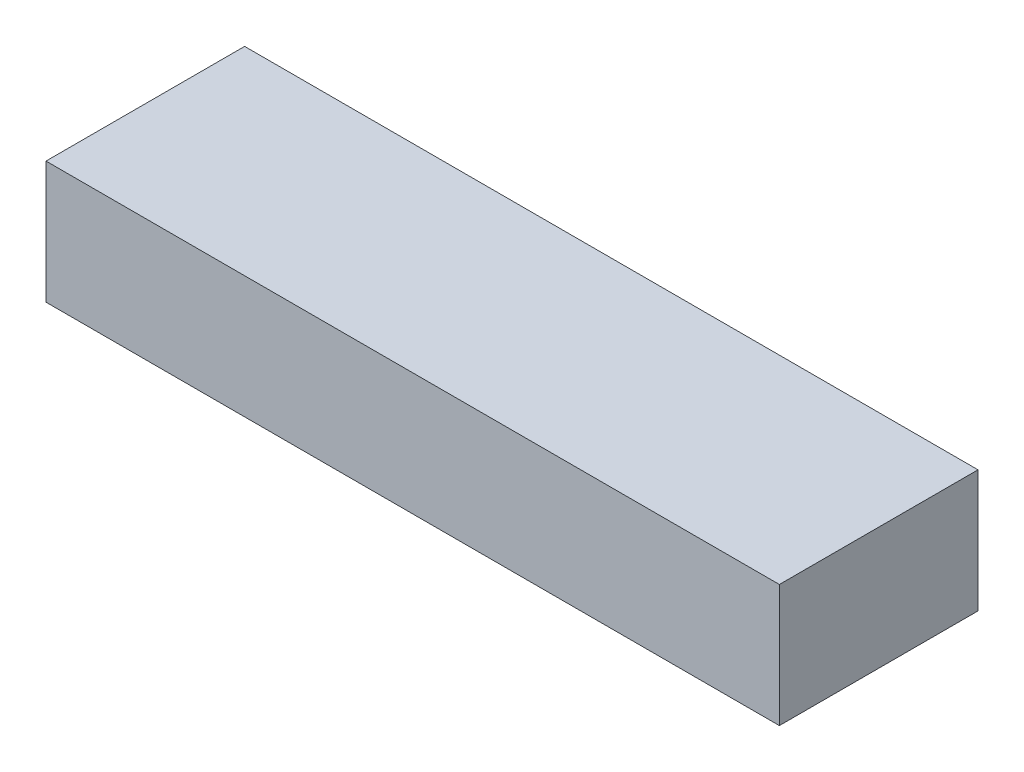
ISO-10303-21;
HEADER;
FILE_DESCRIPTION(('STEP AP214'),'2;1');
FILE_NAME('part.step','',(''),(''),'','','');
FILE_SCHEMA(('AUTOMOTIVE_DESIGN { 1 0 10303 214 1 1 1 1 }'));
ENDSEC;
DATA;
#1=APPLICATION_CONTEXT('core data for automotive mechanical design processes');
#2=APPLICATION_PROTOCOL_DEFINITION('international standard','automotive_design',2000,#1);
#3=PRODUCT_CONTEXT('',#1,'mechanical');
#4=PRODUCT('Part','Part','',(#3));
#5=PRODUCT_RELATED_PRODUCT_CATEGORY('part','',(#4));
#6=PRODUCT_DEFINITION_FORMATION('','',#4);
#7=PRODUCT_DEFINITION_CONTEXT('part definition',#1,'design');
#8=PRODUCT_DEFINITION('design','',#6,#7);
#9=PRODUCT_DEFINITION_SHAPE('','',#8);
#10=(LENGTH_UNIT() NAMED_UNIT(*) SI_UNIT(.MILLI.,.METRE.));
#11=(NAMED_UNIT(*) PLANE_ANGLE_UNIT() SI_UNIT($,.RADIAN.));
#12=(NAMED_UNIT(*) SI_UNIT($,.STERADIAN.) SOLID_ANGLE_UNIT());
#13=UNCERTAINTY_MEASURE_WITH_UNIT(LENGTH_MEASURE(1.E-05),#10,'distance_accuracy_value','');
#14=(GEOMETRIC_REPRESENTATION_CONTEXT(3) GLOBAL_UNCERTAINTY_ASSIGNED_CONTEXT((#13)) GLOBAL_UNIT_ASSIGNED_CONTEXT((#10,
#11,#12)) REPRESENTATION_CONTEXT('',''));
#15=CARTESIAN_POINT('',(0.,0.,0.));
#16=DIRECTION('',(0.,0.,1.));
#17=DIRECTION('',(1.,0.,0.));
#18=AXIS2_PLACEMENT_3D('',#15,#16,#17);
#19=CARTESIAN_POINT('',(0.,25.4,0.));
#20=DIRECTION('',(1.,0.,0.));
#21=DIRECTION('',(0.,0.,-1.));
#22=AXIS2_PLACEMENT_3D('',#19,#20,#21);
#23=PLANE('',#22);
#24=DIRECTION('',(0.,0.,1.));
#25=VECTOR('',#24,1.);
#26=CARTESIAN_POINT('',(0.,0.,0.));
#27=LINE('',#26,#25);
#28=CARTESIAN_POINT('',(0.,0.,-41.275));
#29=VERTEX_POINT('',#28);
#30=CARTESIAN_POINT('',(0.,0.,0.));
#31=VERTEX_POINT('',#30);
#32=EDGE_CURVE('E107',#29,#31,#27,.T.);
#33=ORIENTED_EDGE('',*,*,#32,.T.);
#34=DIRECTION('',(0.,-1.,0.));
#35=VECTOR('',#34,1.);
#36=CARTESIAN_POINT('',(0.,25.4,0.));
#37=LINE('',#36,#35);
#38=CARTESIAN_POINT('',(0.,25.4,0.));
#39=VERTEX_POINT('',#38);
#40=EDGE_CURVE('E11',#39,#31,#37,.T.);
#41=ORIENTED_EDGE('',*,*,#40,.F.);
#42=DIRECTION('',(0.,0.,1.));
#43=VECTOR('',#42,1.);
#44=CARTESIAN_POINT('',(0.,25.4,0.));
#45=LINE('',#44,#43);
#46=CARTESIAN_POINT('',(0.,25.4,-41.275));
#47=VERTEX_POINT('',#46);
#48=EDGE_CURVE('E91',#47,#39,#45,.T.);
#49=ORIENTED_EDGE('',*,*,#48,.F.);
#50=DIRECTION('',(0.,-1.,0.));
#51=VECTOR('',#50,1.);
#52=CARTESIAN_POINT('',(0.,25.4,-41.275));
#53=LINE('',#52,#51);
#54=EDGE_CURVE('E103',#47,#29,#53,.T.);
#55=ORIENTED_EDGE('',*,*,#54,.T.);
#56=EDGE_LOOP('',(#33,#41,#49,#55));
#57=FACE_BOUND('',#56,.T.);
#58=ADVANCED_FACE('F39',(#57),#23,.F.);
#59=CARTESIAN_POINT('',(0.,25.4,0.));
#60=DIRECTION('',(0.,0.,-1.));
#61=DIRECTION('',(-1.,0.,0.));
#62=AXIS2_PLACEMENT_3D('',#59,#60,#61);
#63=PLANE('',#62);
#64=DIRECTION('',(1.,0.,0.));
#65=VECTOR('',#64,1.);
#66=CARTESIAN_POINT('',(0.,0.,0.));
#67=LINE('',#66,#65);
#68=CARTESIAN_POINT('',(152.4,0.,0.));
#69=VERTEX_POINT('',#68);
#70=EDGE_CURVE('E96',#31,#69,#67,.T.);
#71=ORIENTED_EDGE('',*,*,#70,.T.);
#72=DIRECTION('',(0.,-1.,0.));
#73=VECTOR('',#72,1.);
#74=CARTESIAN_POINT('',(152.4,25.4,0.));
#75=LINE('',#74,#73);
#76=CARTESIAN_POINT('',(152.4,25.4,0.));
#77=VERTEX_POINT('',#76);
#78=EDGE_CURVE('E48',#77,#69,#75,.T.);
#79=ORIENTED_EDGE('',*,*,#78,.F.);
#80=DIRECTION('',(1.,0.,0.));
#81=VECTOR('',#80,1.);
#82=CARTESIAN_POINT('',(0.,25.4,0.));
#83=LINE('',#82,#81);
#84=EDGE_CURVE('E86',#39,#77,#83,.T.);
#85=ORIENTED_EDGE('',*,*,#84,.F.);
#86=ORIENTED_EDGE('',*,*,#40,.T.);
#87=EDGE_LOOP('',(#71,#79,#85,#86));
#88=FACE_BOUND('',#87,.T.);
#89=ADVANCED_FACE('F95',(#88),#63,.F.);
#90=CARTESIAN_POINT('',(152.4,25.4,0.));
#91=DIRECTION('',(-1.,0.,0.));
#92=DIRECTION('',(0.,0.,1.));
#93=AXIS2_PLACEMENT_3D('',#90,#91,#92);
#94=PLANE('',#93);
#95=DIRECTION('',(0.,0.,-1.));
#96=VECTOR('',#95,1.);
#97=CARTESIAN_POINT('',(152.4,0.,0.));
#98=LINE('',#97,#96);
#99=CARTESIAN_POINT('',(152.4,0.,-41.275));
#100=VERTEX_POINT('',#99);
#101=EDGE_CURVE('E73',#69,#100,#98,.T.);
#102=ORIENTED_EDGE('',*,*,#101,.T.);
#103=DIRECTION('',(0.,-1.,0.));
#104=VECTOR('',#103,1.);
#105=CARTESIAN_POINT('',(152.4,25.4,-41.275));
#106=LINE('',#105,#104);
#107=CARTESIAN_POINT('',(152.4,25.4,-41.275));
#108=VERTEX_POINT('',#107);
#109=EDGE_CURVE('E98',#108,#100,#106,.T.);
#110=ORIENTED_EDGE('',*,*,#109,.F.);
#111=DIRECTION('',(0.,0.,-1.));
#112=VECTOR('',#111,1.);
#113=CARTESIAN_POINT('',(152.4,25.4,0.));
#114=LINE('',#113,#112);
#115=EDGE_CURVE('E89',#77,#108,#114,.T.);
#116=ORIENTED_EDGE('',*,*,#115,.F.);
#117=ORIENTED_EDGE('',*,*,#78,.T.);
#118=EDGE_LOOP('',(#102,#110,#116,#117));
#119=FACE_BOUND('',#118,.T.);
#120=ADVANCED_FACE('F99',(#119),#94,.F.);
#121=CARTESIAN_POINT('',(0.,25.4,-41.275));
#122=DIRECTION('',(0.,0.,1.));
#123=DIRECTION('',(1.,0.,0.));
#124=AXIS2_PLACEMENT_3D('',#121,#122,#123);
#125=PLANE('',#124);
#126=DIRECTION('',(-1.,0.,0.));
#127=VECTOR('',#126,1.);
#128=CARTESIAN_POINT('',(0.,0.,-41.275));
#129=LINE('',#128,#127);
#130=EDGE_CURVE('E79',#100,#29,#129,.T.);
#131=ORIENTED_EDGE('',*,*,#130,.T.);
#132=ORIENTED_EDGE('',*,*,#54,.F.);
#133=DIRECTION('',(-1.,0.,0.));
#134=VECTOR('',#133,1.);
#135=CARTESIAN_POINT('',(0.,25.4,-41.275));
#136=LINE('',#135,#134);
#137=EDGE_CURVE('E56',#108,#47,#136,.T.);
#138=ORIENTED_EDGE('',*,*,#137,.F.);
#139=ORIENTED_EDGE('',*,*,#109,.T.);
#140=EDGE_LOOP('',(#131,#132,#138,#139));
#141=FACE_BOUND('',#140,.T.);
#142=ADVANCED_FACE('F120',(#141),#125,.F.);
#143=CARTESIAN_POINT('',(0.,25.4,0.));
#144=DIRECTION('',(0.,-1.,0.));
#145=DIRECTION('',(0.,0.,-1.));
#146=AXIS2_PLACEMENT_3D('',#143,#144,#145);
#147=PLANE('',#146);
#148=ORIENTED_EDGE('',*,*,#48,.T.);
#149=ORIENTED_EDGE('',*,*,#84,.T.);
#150=ORIENTED_EDGE('',*,*,#115,.T.);
#151=ORIENTED_EDGE('',*,*,#137,.T.);
#152=EDGE_LOOP('',(#148,#149,#150,#151));
#153=FACE_BOUND('',#152,.T.);
#154=ADVANCED_FACE('F87',(#153),#147,.F.);
#155=CARTESIAN_POINT('',(0.,0.,0.));
#156=DIRECTION('',(0.,-1.,0.));
#157=DIRECTION('',(0.,0.,-1.));
#158=AXIS2_PLACEMENT_3D('',#155,#156,#157);
#159=PLANE('',#158);
#160=ORIENTED_EDGE('',*,*,#32,.F.);
#161=ORIENTED_EDGE('',*,*,#130,.F.);
#162=ORIENTED_EDGE('',*,*,#101,.F.);
#163=ORIENTED_EDGE('',*,*,#70,.F.);
#164=EDGE_LOOP('',(#160,#161,#162,#163));
#165=FACE_BOUND('',#164,.T.);
#166=ADVANCED_FACE('F123',(#165),#159,.T.);
#167=CLOSED_SHELL('',(#58,#89,#120,#142,#154,#166));
#168=MANIFOLD_SOLID_BREP('B2',#167);
#169=ADVANCED_BREP_SHAPE_REPRESENTATION('',(#18,#168),#14);
#170=SHAPE_DEFINITION_REPRESENTATION(#9,#169);
ENDSEC;
END-ISO-10303-21;
